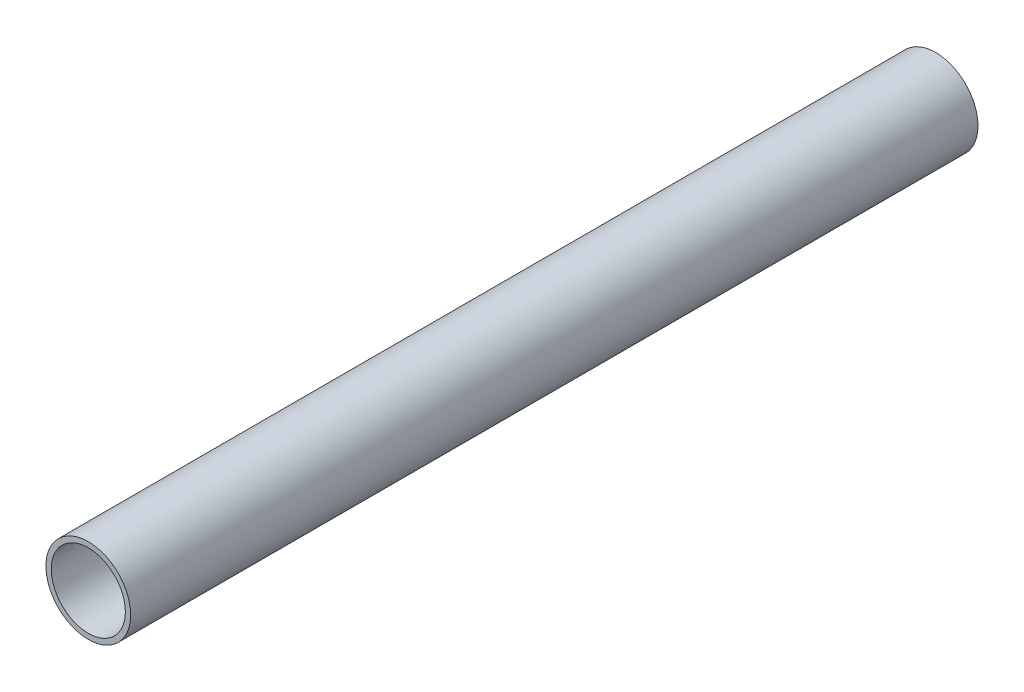
ISO-10303-21;
HEADER;
FILE_DESCRIPTION(('STEP AP214'),'2;1');
FILE_NAME('part.step','',(''),(''),'','','');
FILE_SCHEMA(('AUTOMOTIVE_DESIGN { 1 0 10303 214 1 1 1 1 }'));
ENDSEC;
DATA;
#1=APPLICATION_CONTEXT('core data for automotive mechanical design processes');
#2=APPLICATION_PROTOCOL_DEFINITION('international standard','automotive_design',2000,#1);
#3=PRODUCT_CONTEXT('',#1,'mechanical');
#4=PRODUCT('Part','Part','',(#3));
#5=PRODUCT_RELATED_PRODUCT_CATEGORY('part','',(#4));
#6=PRODUCT_DEFINITION_FORMATION('','',#4);
#7=PRODUCT_DEFINITION_CONTEXT('part definition',#1,'design');
#8=PRODUCT_DEFINITION('design','',#6,#7);
#9=PRODUCT_DEFINITION_SHAPE('','',#8);
#10=(LENGTH_UNIT() NAMED_UNIT(*) SI_UNIT(.MILLI.,.METRE.));
#11=(NAMED_UNIT(*) PLANE_ANGLE_UNIT() SI_UNIT($,.RADIAN.));
#12=(NAMED_UNIT(*) SI_UNIT($,.STERADIAN.) SOLID_ANGLE_UNIT());
#13=UNCERTAINTY_MEASURE_WITH_UNIT(LENGTH_MEASURE(1.E-05),#10,'distance_accuracy_value','');
#14=(GEOMETRIC_REPRESENTATION_CONTEXT(3) GLOBAL_UNCERTAINTY_ASSIGNED_CONTEXT((#13)) GLOBAL_UNIT_ASSIGNED_CONTEXT((#10,
#11,#12)) REPRESENTATION_CONTEXT('',''));
#15=CARTESIAN_POINT('',(0.,0.,0.));
#16=DIRECTION('',(0.,0.,1.));
#17=DIRECTION('',(1.,0.,0.));
#18=AXIS2_PLACEMENT_3D('',#15,#16,#17);
#19=CARTESIAN_POINT('',(0.,0.,160.));
#20=DIRECTION('',(0.,0.,1.));
#21=DIRECTION('',(1.,0.,0.));
#22=AXIS2_PLACEMENT_3D('',#19,#20,#21);
#23=PLANE('',#22);
#24=CARTESIAN_POINT('',(0.,0.,160.));
#25=DIRECTION('',(0.,0.,1.));
#26=DIRECTION('',(1.,0.,0.));
#27=AXIS2_PLACEMENT_3D('',#24,#25,#26);
#28=CIRCLE('',#27,8.);
#29=CARTESIAN_POINT('',(8.,0.,160.));
#30=VERTEX_POINT('',#29);
#31=EDGE_CURVE('E10',#30,#30,#28,.T.);
#32=ORIENTED_EDGE('',*,*,#31,.T.);
#33=EDGE_LOOP('',(#32));
#34=FACE_BOUND('',#33,.T.);
#35=CARTESIAN_POINT('',(0.,0.,160.));
#36=DIRECTION('',(0.,0.,1.));
#37=DIRECTION('',(1.,0.,0.));
#38=AXIS2_PLACEMENT_3D('',#35,#36,#37);
#39=CIRCLE('',#38,7.);
#40=CARTESIAN_POINT('',(7.,0.,160.));
#41=VERTEX_POINT('',#40);
#42=EDGE_CURVE('E41',#41,#41,#39,.T.);
#43=ORIENTED_EDGE('',*,*,#42,.F.);
#44=EDGE_LOOP('',(#43));
#45=FACE_BOUND('',#44,.T.);
#46=ADVANCED_FACE('F30',(#34,#45),#23,.T.);
#47=CARTESIAN_POINT('',(0.,0.,0.));
#48=DIRECTION('',(0.,0.,1.));
#49=DIRECTION('',(1.,0.,0.));
#50=AXIS2_PLACEMENT_3D('',#47,#48,#49);
#51=PLANE('',#50);
#52=CARTESIAN_POINT('',(0.,0.,0.));
#53=DIRECTION('',(0.,0.,1.));
#54=DIRECTION('',(1.,0.,0.));
#55=AXIS2_PLACEMENT_3D('',#52,#53,#54);
#56=CIRCLE('',#55,8.);
#57=CARTESIAN_POINT('',(8.,0.,0.));
#58=VERTEX_POINT('',#57);
#59=EDGE_CURVE('E34',#58,#58,#56,.T.);
#60=ORIENTED_EDGE('',*,*,#59,.F.);
#61=EDGE_LOOP('',(#60));
#62=FACE_BOUND('',#61,.T.);
#63=CARTESIAN_POINT('',(0.,0.,0.));
#64=DIRECTION('',(0.,0.,1.));
#65=DIRECTION('',(1.,0.,0.));
#66=AXIS2_PLACEMENT_3D('',#63,#64,#65);
#67=CIRCLE('',#66,7.);
#68=CARTESIAN_POINT('',(7.,0.,0.));
#69=VERTEX_POINT('',#68);
#70=EDGE_CURVE('E43',#69,#69,#67,.T.);
#71=ORIENTED_EDGE('',*,*,#70,.T.);
#72=EDGE_LOOP('',(#71));
#73=FACE_BOUND('',#72,.T.);
#74=ADVANCED_FACE('F53',(#62,#73),#51,.F.);
#75=CARTESIAN_POINT('',(0.,0.,160.));
#76=DIRECTION('',(0.,0.,-1.));
#77=DIRECTION('',(-1.,0.,0.));
#78=AXIS2_PLACEMENT_3D('',#75,#76,#77);
#79=CYLINDRICAL_SURFACE('',#78,8.);
#80=ORIENTED_EDGE('',*,*,#31,.F.);
#81=EDGE_LOOP('',(#80));
#82=FACE_BOUND('',#81,.T.);
#83=ORIENTED_EDGE('',*,*,#59,.T.);
#84=EDGE_LOOP('',(#83));
#85=FACE_BOUND('',#84,.T.);
#86=ADVANCED_FACE('F32',(#82,#85),#79,.T.);
#87=CARTESIAN_POINT('',(0.,0.,160.));
#88=DIRECTION('',(0.,0.,-1.));
#89=DIRECTION('',(-1.,0.,0.));
#90=AXIS2_PLACEMENT_3D('',#87,#88,#89);
#91=CYLINDRICAL_SURFACE('',#90,7.);
#92=ORIENTED_EDGE('',*,*,#42,.T.);
#93=EDGE_LOOP('',(#92));
#94=FACE_BOUND('',#93,.T.);
#95=ORIENTED_EDGE('',*,*,#70,.F.);
#96=EDGE_LOOP('',(#95));
#97=FACE_BOUND('',#96,.T.);
#98=ADVANCED_FACE('F49',(#94,#97),#91,.F.);
#99=CLOSED_SHELL('',(#46,#74,#86,#98));
#100=MANIFOLD_SOLID_BREP('B2',#99);
#101=ADVANCED_BREP_SHAPE_REPRESENTATION('',(#18,#100),#14);
#102=SHAPE_DEFINITION_REPRESENTATION(#9,#101);
ENDSEC;
END-ISO-10303-21;
